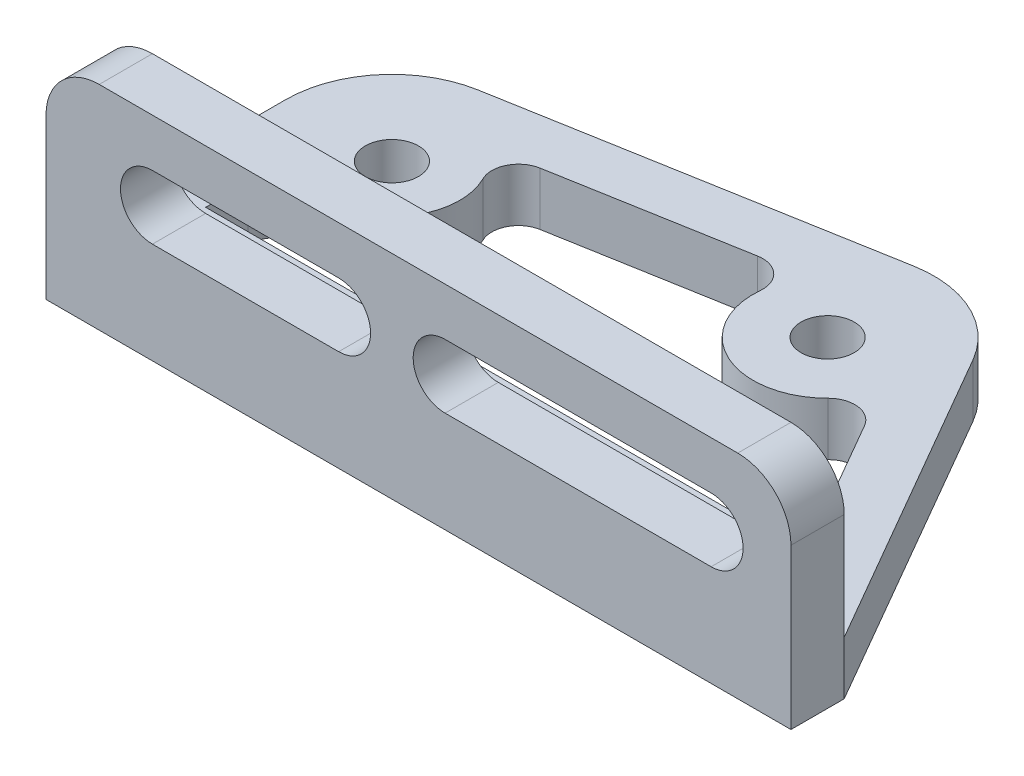
ISO-10303-21;
HEADER;
FILE_DESCRIPTION(('STEP AP214'),'2;1');
FILE_NAME('part.step','',(''),(''),'','','');
FILE_SCHEMA(('AUTOMOTIVE_DESIGN { 1 0 10303 214 1 1 1 1 }'));
ENDSEC;
DATA;
#1=APPLICATION_CONTEXT('core data for automotive mechanical design processes');
#2=APPLICATION_PROTOCOL_DEFINITION('international standard','automotive_design',2000,#1);
#3=PRODUCT_CONTEXT('',#1,'mechanical');
#4=PRODUCT('Part','Part','',(#3));
#5=PRODUCT_RELATED_PRODUCT_CATEGORY('part','',(#4));
#6=PRODUCT_DEFINITION_FORMATION('','',#4);
#7=PRODUCT_DEFINITION_CONTEXT('part definition',#1,'design');
#8=PRODUCT_DEFINITION('design','',#6,#7);
#9=PRODUCT_DEFINITION_SHAPE('','',#8);
#10=(LENGTH_UNIT() NAMED_UNIT(*) SI_UNIT(.MILLI.,.METRE.));
#11=(NAMED_UNIT(*) PLANE_ANGLE_UNIT() SI_UNIT($,.RADIAN.));
#12=(NAMED_UNIT(*) SI_UNIT($,.STERADIAN.) SOLID_ANGLE_UNIT());
#13=UNCERTAINTY_MEASURE_WITH_UNIT(LENGTH_MEASURE(1.E-05),#10,'distance_accuracy_value','');
#14=(GEOMETRIC_REPRESENTATION_CONTEXT(3) GLOBAL_UNCERTAINTY_ASSIGNED_CONTEXT((#13)) GLOBAL_UNIT_ASSIGNED_CONTEXT((#10,
#11,#12)) REPRESENTATION_CONTEXT('',''));
#15=CARTESIAN_POINT('',(0.,0.,0.));
#16=DIRECTION('',(0.,0.,1.));
#17=DIRECTION('',(1.,0.,0.));
#18=AXIS2_PLACEMENT_3D('',#15,#16,#17);
#19=CARTESIAN_POINT('',(20.,10.,-35.));
#20=DIRECTION('',(0.,-1.,0.));
#21=DIRECTION('',(0.,0.,-1.));
#22=AXIS2_PLACEMENT_3D('',#19,#20,#21);
#23=PLANE('',#22);
#24=DIRECTION('',(1.,0.,0.));
#25=VECTOR('',#24,1.);
#26=CARTESIAN_POINT('',(140.,10.,0.));
#27=LINE('',#26,#25);
#28=CARTESIAN_POINT('',(0.,10.,0.));
#29=VERTEX_POINT('',#28);
#30=CARTESIAN_POINT('',(140.,10.,0.));
#31=VERTEX_POINT('',#30);
#32=EDGE_CURVE('E385',#29,#31,#27,.T.);
#33=ORIENTED_EDGE('',*,*,#32,.T.);
#34=DIRECTION('',(-0.500000000000004,0.,-0.866025403784436));
#35=VECTOR('',#34,1.);
#36=CARTESIAN_POINT('',(106.932561687035,10.,-57.2744832342041));
#37=LINE('',#36,#35);
#38=CARTESIAN_POINT('',(106.932561687035,10.,-57.2744832342041));
#39=VERTEX_POINT('',#38);
#40=EDGE_CURVE('E388',#31,#39,#37,.T.);
#41=ORIENTED_EDGE('',*,*,#40,.T.);
#42=CARTESIAN_POINT('',(89.6120536113465,10.,-47.274483234204));
#43=DIRECTION('',(0.,1.,0.));
#44=DIRECTION('',(0.,0.,-1.));
#45=AXIS2_PLACEMENT_3D('',#42,#43,#44);
#46=CIRCLE('',#45,20.);
#47=CARTESIAN_POINT('',(86.139090058008,10.,-66.9706382944482));
#48=VERTEX_POINT('',#47);
#49=EDGE_CURVE('E391',#39,#48,#46,.T.);
#50=ORIENTED_EDGE('',*,*,#49,.T.);
#51=DIRECTION('',(-0.984807753012209,0.,0.173648177666924));
#52=VECTOR('',#51,1.);
#53=CARTESIAN_POINT('',(16.5270364466615,10.,-54.6961550602442));
#54=LINE('',#53,#52);
#55=CARTESIAN_POINT('',(16.5270364466615,10.,-54.6961550602442));
#56=VERTEX_POINT('',#55);
#57=EDGE_CURVE('E393',#48,#56,#54,.T.);
#58=ORIENTED_EDGE('',*,*,#57,.T.);
#59=CARTESIAN_POINT('',(20.,10.,-35.));
#60=DIRECTION('',(0.,1.,0.));
#61=DIRECTION('',(0.,0.,-1.));
#62=AXIS2_PLACEMENT_3D('',#59,#60,#61);
#63=CIRCLE('',#62,20.);
#64=CARTESIAN_POINT('',(0.,10.,-35.));
#65=VERTEX_POINT('',#64);
#66=EDGE_CURVE('E395',#56,#65,#63,.T.);
#67=ORIENTED_EDGE('',*,*,#66,.T.);
#68=DIRECTION('',(0.,0.,1.));
#69=VECTOR('',#68,1.);
#70=CARTESIAN_POINT('',(0.,10.,0.));
#71=LINE('',#70,#69);
#72=EDGE_CURVE('E397',#65,#29,#71,.T.);
#73=ORIENTED_EDGE('',*,*,#72,.T.);
#74=EDGE_LOOP('',(#33,#41,#50,#58,#67,#73));
#75=FACE_BOUND('',#74,.T.);
#76=DIRECTION('',(-0.5,0.,-0.866025403784439));
#77=VECTOR('',#76,1.);
#78=CARTESIAN_POINT('',(107.44176757749,10.,-36.3925127604223));
#79=LINE('',#78,#77);
#80=CARTESIAN_POINT('',(122.679491924311,10.,-10.));
#81=VERTEX_POINT('',#80);
#82=CARTESIAN_POINT('',(107.44176757749,10.,-36.3925127604223));
#83=VERTEX_POINT('',#82);
#84=EDGE_CURVE('E312',#81,#83,#79,.T.);
#85=ORIENTED_EDGE('',*,*,#84,.F.);
#86=DIRECTION('',(1.,0.,0.));
#87=VECTOR('',#86,1.);
#88=CARTESIAN_POINT('',(122.679491924311,10.,-10.));
#89=LINE('',#88,#87);
#90=CARTESIAN_POINT('',(10.,10.,-10.));
#91=VERTEX_POINT('',#90);
#92=EDGE_CURVE('E332',#91,#81,#89,.T.);
#93=ORIENTED_EDGE('',*,*,#92,.F.);
#94=DIRECTION('',(0.,0.,1.));
#95=VECTOR('',#94,1.);
#96=CARTESIAN_POINT('',(10.,10.,-10.));
#97=LINE('',#96,#95);
#98=CARTESIAN_POINT('',(10.,10.,-17.9621628546094));
#99=VERTEX_POINT('',#98);
#100=EDGE_CURVE('E329',#99,#91,#97,.T.);
#101=ORIENTED_EDGE('',*,*,#100,.F.);
#102=CARTESIAN_POINT('',(15.,10.,-17.9621628546094));
#103=DIRECTION('',(0.,1.,0.));
#104=DIRECTION('',(0.,0.,1.));
#105=AXIS2_PLACEMENT_3D('',#102,#103,#104);
#106=CIRCLE('',#105,5.);
#107=CARTESIAN_POINT('',(16.4079471740627,10.,-22.7598377868082));
#108=VERTEX_POINT('',#107);
#109=EDGE_CURVE('E327',#108,#99,#106,.T.);
#110=ORIENTED_EDGE('',*,*,#109,.F.);
#111=CARTESIAN_POINT('',(20.,10.,-35.));
#112=DIRECTION('',(0.,-1.,0.));
#113=DIRECTION('',(0.,0.,1.));
#114=AXIS2_PLACEMENT_3D('',#111,#112,#113);
#115=CIRCLE('',#114,12.756348008328);
#116=CARTESIAN_POINT('',(31.4304532183711,10.,-40.6629633348807));
#117=VERTEX_POINT('',#116);
#118=EDGE_CURVE('E325',#117,#108,#115,.T.);
#119=ORIENTED_EDGE('',*,*,#118,.F.);
#120=CARTESIAN_POINT('',(35.9107532270055,10.,-42.882628136744));
#121=DIRECTION('',(0.,1.,0.));
#122=DIRECTION('',(0.,0.,-1.));
#123=AXIS2_PLACEMENT_3D('',#120,#121,#122);
#124=CIRCLE('',#123,5.);
#125=CARTESIAN_POINT('',(35.0425123386709,10.,-47.806666901805));
#126=VERTEX_POINT('',#125);
#127=EDGE_CURVE('E323',#126,#117,#124,.T.);
#128=ORIENTED_EDGE('',*,*,#127,.F.);
#129=DIRECTION('',(-0.984807753012209,0.,0.173648177666923));
#130=VECTOR('',#129,1.);
#131=CARTESIAN_POINT('',(35.0425123386709,10.,-47.806666901805));
#132=LINE('',#131,#130);
#133=CARTESIAN_POINT('',(69.8152613780289,10.,-53.9380407508479));
#134=VERTEX_POINT('',#133);
#135=EDGE_CURVE('E321',#134,#126,#132,.T.);
#136=ORIENTED_EDGE('',*,*,#135,.F.);
#137=CARTESIAN_POINT('',(70.6835022663635,10.,-49.0140019857869));
#138=DIRECTION('',(0.,1.,0.));
#139=DIRECTION('',(0.,0.,1.));
#140=AXIS2_PLACEMENT_3D('',#137,#138,#139);
#141=CIRCLE('',#140,5.);
#142=CARTESIAN_POINT('',(75.6625214099861,10.,-48.5564341029115));
#143=VERTEX_POINT('',#142);
#144=EDGE_CURVE('E319',#143,#134,#141,.T.);
#145=ORIENTED_EDGE('',*,*,#144,.F.);
#146=CARTESIAN_POINT('',(89.6120536113465,10.,-47.274483234204));
#147=DIRECTION('',(0.,-1.,0.));
#148=DIRECTION('',(0.,0.,1.));
#149=AXIS2_PLACEMENT_3D('',#146,#147,#148);
#150=CIRCLE('',#149,14.0083134840197);
#151=CARTESIAN_POINT('',(99.5606714106291,10.,-37.4125437418747));
#152=VERTEX_POINT('',#151);
#153=EDGE_CURVE('E317',#152,#143,#150,.T.);
#154=ORIENTED_EDGE('',*,*,#153,.F.);
#155=CARTESIAN_POINT('',(103.111640558568,10.,-33.8925127604223));
#156=DIRECTION('',(0.,1.,0.));
#157=DIRECTION('',(0.,0.,-1.));
#158=AXIS2_PLACEMENT_3D('',#155,#156,#157);
#159=CIRCLE('',#158,5.);
#160=EDGE_CURVE('E314',#83,#152,#159,.T.);
#161=ORIENTED_EDGE('',*,*,#160,.F.);
#162=EDGE_LOOP('',(#85,#93,#101,#110,#119,#128,#136,#145,#154,#161));
#163=FACE_BOUND('',#162,.T.);
#164=CARTESIAN_POINT('',(20.,10.,-35.));
#165=DIRECTION('',(0.,1.,0.));
#166=DIRECTION('',(0.,0.,1.));
#167=AXIS2_PLACEMENT_3D('',#164,#165,#166);
#168=CIRCLE('',#167,5.);
#169=CARTESIAN_POINT('',(20.,10.,-30.));
#170=VERTEX_POINT('',#169);
#171=EDGE_CURVE('E306',#170,#170,#168,.T.);
#172=ORIENTED_EDGE('',*,*,#171,.F.);
#173=EDGE_LOOP('',(#172));
#174=FACE_BOUND('',#173,.T.);
#175=CARTESIAN_POINT('',(89.6120536113465,10.,-47.274483234204));
#176=DIRECTION('',(0.,1.,0.));
#177=DIRECTION('',(0.,0.,1.));
#178=AXIS2_PLACEMENT_3D('',#175,#176,#177);
#179=CIRCLE('',#178,5.00000000000001);
#180=CARTESIAN_POINT('',(89.6120536113465,10.,-42.274483234204));
#181=VERTEX_POINT('',#180);
#182=EDGE_CURVE('E300',#181,#181,#179,.T.);
#183=ORIENTED_EDGE('',*,*,#182,.F.);
#184=EDGE_LOOP('',(#183));
#185=FACE_BOUND('',#184,.T.);
#186=ADVANCED_FACE('F35',(#75,#163,#174,#185),#23,.F.);
#187=CARTESIAN_POINT('',(20.,0.,-35.));
#188=DIRECTION('',(0.,-1.,0.));
#189=DIRECTION('',(0.,0.,-1.));
#190=AXIS2_PLACEMENT_3D('',#187,#188,#189);
#191=PLANE('',#190);
#192=CARTESIAN_POINT('',(20.,0.,-35.));
#193=DIRECTION('',(0.,1.,0.));
#194=DIRECTION('',(0.,0.,1.));
#195=AXIS2_PLACEMENT_3D('',#192,#193,#194);
#196=CIRCLE('',#195,5.);
#197=CARTESIAN_POINT('',(20.,0.,-30.));
#198=VERTEX_POINT('',#197);
#199=EDGE_CURVE('E303',#198,#198,#196,.T.);
#200=ORIENTED_EDGE('',*,*,#199,.T.);
#201=EDGE_LOOP('',(#200));
#202=FACE_BOUND('',#201,.T.);
#203=DIRECTION('',(-0.500000000000004,0.,-0.866025403784436));
#204=VECTOR('',#203,1.);
#205=CARTESIAN_POINT('',(106.932561687035,0.,-57.2744832342041));
#206=LINE('',#205,#204);
#207=CARTESIAN_POINT('',(140.,0.,0.));
#208=VERTEX_POINT('',#207);
#209=CARTESIAN_POINT('',(106.932561687035,0.,-57.2744832342041));
#210=VERTEX_POINT('',#209);
#211=EDGE_CURVE('E384',#208,#210,#206,.T.);
#212=ORIENTED_EDGE('',*,*,#211,.F.);
#213=DIRECTION('',(0.,0.,-1.));
#214=VECTOR('',#213,1.);
#215=CARTESIAN_POINT('',(140.,0.,0.));
#216=LINE('',#215,#214);
#217=CARTESIAN_POINT('',(140.,0.,10.));
#218=VERTEX_POINT('',#217);
#219=EDGE_CURVE('E288',#218,#208,#216,.T.);
#220=ORIENTED_EDGE('',*,*,#219,.F.);
#221=DIRECTION('',(1.,0.,0.));
#222=VECTOR('',#221,1.);
#223=CARTESIAN_POINT('',(0.,0.,10.));
#224=LINE('',#223,#222);
#225=CARTESIAN_POINT('',(0.,0.,10.));
#226=VERTEX_POINT('',#225);
#227=EDGE_CURVE('E285',#226,#218,#224,.T.);
#228=ORIENTED_EDGE('',*,*,#227,.F.);
#229=DIRECTION('',(0.,0.,1.));
#230=VECTOR('',#229,1.);
#231=CARTESIAN_POINT('',(0.,0.,0.));
#232=LINE('',#231,#230);
#233=CARTESIAN_POINT('',(0.,0.,-35.));
#234=VERTEX_POINT('',#233);
#235=EDGE_CURVE('E389',#234,#226,#232,.T.);
#236=ORIENTED_EDGE('',*,*,#235,.F.);
#237=CARTESIAN_POINT('',(20.,0.,-35.));
#238=DIRECTION('',(0.,1.,0.));
#239=DIRECTION('',(0.,0.,-1.));
#240=AXIS2_PLACEMENT_3D('',#237,#238,#239);
#241=CIRCLE('',#240,20.);
#242=CARTESIAN_POINT('',(16.5270364466615,0.,-54.6961550602442));
#243=VERTEX_POINT('',#242);
#244=EDGE_CURVE('E406',#243,#234,#241,.T.);
#245=ORIENTED_EDGE('',*,*,#244,.F.);
#246=DIRECTION('',(-0.984807753012209,0.,0.173648177666924));
#247=VECTOR('',#246,1.);
#248=CARTESIAN_POINT('',(16.5270364466615,0.,-54.6961550602442));
#249=LINE('',#248,#247);
#250=CARTESIAN_POINT('',(86.139090058008,0.,-66.9706382944482));
#251=VERTEX_POINT('',#250);
#252=EDGE_CURVE('E404',#251,#243,#249,.T.);
#253=ORIENTED_EDGE('',*,*,#252,.F.);
#254=CARTESIAN_POINT('',(89.6120536113465,0.,-47.274483234204));
#255=DIRECTION('',(0.,1.,0.));
#256=DIRECTION('',(0.,0.,-1.));
#257=AXIS2_PLACEMENT_3D('',#254,#255,#256);
#258=CIRCLE('',#257,20.);
#259=EDGE_CURVE('E402',#210,#251,#258,.T.);
#260=ORIENTED_EDGE('',*,*,#259,.F.);
#261=EDGE_LOOP('',(#212,#220,#228,#236,#245,#253,#260));
#262=FACE_BOUND('',#261,.T.);
#263=DIRECTION('',(1.,0.,0.));
#264=VECTOR('',#263,1.);
#265=CARTESIAN_POINT('',(122.679491924311,0.,-10.));
#266=LINE('',#265,#264);
#267=CARTESIAN_POINT('',(10.,0.,-10.));
#268=VERTEX_POINT('',#267);
#269=CARTESIAN_POINT('',(122.679491924311,0.,-10.));
#270=VERTEX_POINT('',#269);
#271=EDGE_CURVE('E315',#268,#270,#266,.T.);
#272=ORIENTED_EDGE('',*,*,#271,.T.);
#273=DIRECTION('',(-0.5,0.,-0.866025403784439));
#274=VECTOR('',#273,1.);
#275=CARTESIAN_POINT('',(107.44176757749,0.,-36.3925127604223));
#276=LINE('',#275,#274);
#277=CARTESIAN_POINT('',(107.44176757749,0.,-36.3925127604223));
#278=VERTEX_POINT('',#277);
#279=EDGE_CURVE('E309',#270,#278,#276,.T.);
#280=ORIENTED_EDGE('',*,*,#279,.T.);
#281=CARTESIAN_POINT('',(103.111640558568,0.,-33.8925127604223));
#282=DIRECTION('',(0.,1.,0.));
#283=DIRECTION('',(0.,0.,-1.));
#284=AXIS2_PLACEMENT_3D('',#281,#282,#283);
#285=CIRCLE('',#284,5.);
#286=CARTESIAN_POINT('',(99.5606714106291,0.,-37.4125437418747));
#287=VERTEX_POINT('',#286);
#288=EDGE_CURVE('E337',#278,#287,#285,.T.);
#289=ORIENTED_EDGE('',*,*,#288,.T.);
#290=CARTESIAN_POINT('',(89.6120536113465,0.,-47.274483234204));
#291=DIRECTION('',(0.,-1.,0.));
#292=DIRECTION('',(0.,0.,1.));
#293=AXIS2_PLACEMENT_3D('',#290,#291,#292);
#294=CIRCLE('',#293,14.0083134840197);
#295=CARTESIAN_POINT('',(75.6625214099861,0.,-48.5564341029115));
#296=VERTEX_POINT('',#295);
#297=EDGE_CURVE('E340',#287,#296,#294,.T.);
#298=ORIENTED_EDGE('',*,*,#297,.T.);
#299=CARTESIAN_POINT('',(70.6835022663635,0.,-49.0140019857869));
#300=DIRECTION('',(0.,1.,0.));
#301=DIRECTION('',(0.,0.,1.));
#302=AXIS2_PLACEMENT_3D('',#299,#300,#301);
#303=CIRCLE('',#302,5.);
#304=CARTESIAN_POINT('',(69.8152613780289,0.,-53.9380407508479));
#305=VERTEX_POINT('',#304);
#306=EDGE_CURVE('E343',#296,#305,#303,.T.);
#307=ORIENTED_EDGE('',*,*,#306,.T.);
#308=DIRECTION('',(-0.984807753012209,0.,0.173648177666923));
#309=VECTOR('',#308,1.);
#310=CARTESIAN_POINT('',(35.0425123386709,0.,-47.806666901805));
#311=LINE('',#310,#309);
#312=CARTESIAN_POINT('',(35.0425123386709,0.,-47.806666901805));
#313=VERTEX_POINT('',#312);
#314=EDGE_CURVE('E346',#305,#313,#311,.T.);
#315=ORIENTED_EDGE('',*,*,#314,.T.);
#316=CARTESIAN_POINT('',(35.9107532270055,0.,-42.882628136744));
#317=DIRECTION('',(0.,1.,0.));
#318=DIRECTION('',(0.,0.,-1.));
#319=AXIS2_PLACEMENT_3D('',#316,#317,#318);
#320=CIRCLE('',#319,5.);
#321=CARTESIAN_POINT('',(31.4304532183711,0.,-40.6629633348807));
#322=VERTEX_POINT('',#321);
#323=EDGE_CURVE('E349',#313,#322,#320,.T.);
#324=ORIENTED_EDGE('',*,*,#323,.T.);
#325=CARTESIAN_POINT('',(20.,0.,-35.));
#326=DIRECTION('',(0.,-1.,0.));
#327=DIRECTION('',(0.,0.,1.));
#328=AXIS2_PLACEMENT_3D('',#325,#326,#327);
#329=CIRCLE('',#328,12.756348008328);
#330=CARTESIAN_POINT('',(16.4079471740627,0.,-22.7598377868082));
#331=VERTEX_POINT('',#330);
#332=EDGE_CURVE('E352',#322,#331,#329,.T.);
#333=ORIENTED_EDGE('',*,*,#332,.T.);
#334=CARTESIAN_POINT('',(15.,0.,-17.9621628546094));
#335=DIRECTION('',(0.,1.,0.));
#336=DIRECTION('',(0.,0.,1.));
#337=AXIS2_PLACEMENT_3D('',#334,#335,#336);
#338=CIRCLE('',#337,5.);
#339=CARTESIAN_POINT('',(10.,0.,-17.9621628546094));
#340=VERTEX_POINT('',#339);
#341=EDGE_CURVE('E355',#331,#340,#338,.T.);
#342=ORIENTED_EDGE('',*,*,#341,.T.);
#343=DIRECTION('',(0.,0.,1.));
#344=VECTOR('',#343,1.);
#345=CARTESIAN_POINT('',(10.,0.,-10.));
#346=LINE('',#345,#344);
#347=EDGE_CURVE('E358',#340,#268,#346,.T.);
#348=ORIENTED_EDGE('',*,*,#347,.T.);
#349=EDGE_LOOP('',(#272,#280,#289,#298,#307,#315,#324,#333,#342,#348));
#350=FACE_BOUND('',#349,.T.);
#351=CARTESIAN_POINT('',(89.6120536113465,0.,-47.274483234204));
#352=DIRECTION('',(0.,1.,0.));
#353=DIRECTION('',(0.,0.,1.));
#354=AXIS2_PLACEMENT_3D('',#351,#352,#353);
#355=CIRCLE('',#354,5.00000000000001);
#356=CARTESIAN_POINT('',(89.6120536113465,0.,-42.274483234204));
#357=VERTEX_POINT('',#356);
#358=EDGE_CURVE('E294',#357,#357,#355,.T.);
#359=ORIENTED_EDGE('',*,*,#358,.T.);
#360=EDGE_LOOP('',(#359));
#361=FACE_BOUND('',#360,.T.);
#362=ADVANCED_FACE('F483',(#202,#262,#350,#361),#191,.T.);
#363=CARTESIAN_POINT('',(106.932561687035,10.,-57.2744832342041));
#364=DIRECTION('',(-0.866025403784436,0.,0.500000000000004));
#365=DIRECTION('',(0.500000000000004,0.,0.866025403784436));
#366=AXIS2_PLACEMENT_3D('',#363,#364,#365);
#367=PLANE('',#366);
#368=ORIENTED_EDGE('',*,*,#211,.T.);
#369=DIRECTION('',(0.,-1.,0.));
#370=VECTOR('',#369,1.);
#371=CARTESIAN_POINT('',(106.932561687035,10.,-57.2744832342041));
#372=LINE('',#371,#370);
#373=EDGE_CURVE('E417',#39,#210,#372,.T.);
#374=ORIENTED_EDGE('',*,*,#373,.F.);
#375=ORIENTED_EDGE('',*,*,#40,.F.);
#376=DIRECTION('',(0.,-1.,0.));
#377=VECTOR('',#376,1.);
#378=CARTESIAN_POINT('',(140.,10.,0.));
#379=LINE('',#378,#377);
#380=EDGE_CURVE('E420',#31,#208,#379,.T.);
#381=ORIENTED_EDGE('',*,*,#380,.T.);
#382=EDGE_LOOP('',(#368,#374,#375,#381));
#383=FACE_BOUND('',#382,.T.);
#384=ADVANCED_FACE('F466',(#383),#367,.F.);
#385=CARTESIAN_POINT('',(89.6120536113465,10.,-47.274483234204));
#386=DIRECTION('',(0.,-1.,0.));
#387=DIRECTION('',(0.,0.,-1.));
#388=AXIS2_PLACEMENT_3D('',#385,#386,#387);
#389=CYLINDRICAL_SURFACE('',#388,20.);
#390=ORIENTED_EDGE('',*,*,#259,.T.);
#391=DIRECTION('',(0.,-1.,0.));
#392=VECTOR('',#391,1.);
#393=CARTESIAN_POINT('',(86.139090058008,10.,-66.9706382944482));
#394=LINE('',#393,#392);
#395=EDGE_CURVE('E414',#48,#251,#394,.T.);
#396=ORIENTED_EDGE('',*,*,#395,.F.);
#397=ORIENTED_EDGE('',*,*,#49,.F.);
#398=ORIENTED_EDGE('',*,*,#373,.T.);
#399=EDGE_LOOP('',(#390,#396,#397,#398));
#400=FACE_BOUND('',#399,.T.);
#401=ADVANCED_FACE('F503',(#400),#389,.T.);
#402=CARTESIAN_POINT('',(16.5270364466615,10.,-54.6961550602442));
#403=DIRECTION('',(0.173648177666924,0.,0.984807753012209));
#404=DIRECTION('',(0.984807753012209,0.,-0.173648177666924));
#405=AXIS2_PLACEMENT_3D('',#402,#403,#404);
#406=PLANE('',#405);
#407=ORIENTED_EDGE('',*,*,#252,.T.);
#408=DIRECTION('',(0.,-1.,0.));
#409=VECTOR('',#408,1.);
#410=CARTESIAN_POINT('',(16.5270364466615,10.,-54.6961550602442));
#411=LINE('',#410,#409);
#412=EDGE_CURVE('E411',#56,#243,#411,.T.);
#413=ORIENTED_EDGE('',*,*,#412,.F.);
#414=ORIENTED_EDGE('',*,*,#57,.F.);
#415=ORIENTED_EDGE('',*,*,#395,.T.);
#416=EDGE_LOOP('',(#407,#413,#414,#415));
#417=FACE_BOUND('',#416,.T.);
#418=ADVANCED_FACE('F499',(#417),#406,.F.);
#419=CARTESIAN_POINT('',(20.,10.,-35.));
#420=DIRECTION('',(0.,-1.,0.));
#421=DIRECTION('',(0.,0.,-1.));
#422=AXIS2_PLACEMENT_3D('',#419,#420,#421);
#423=CYLINDRICAL_SURFACE('',#422,20.);
#424=ORIENTED_EDGE('',*,*,#244,.T.);
#425=DIRECTION('',(0.,-1.,0.));
#426=VECTOR('',#425,1.);
#427=CARTESIAN_POINT('',(0.,10.,-35.));
#428=LINE('',#427,#426);
#429=EDGE_CURVE('E400',#65,#234,#428,.T.);
#430=ORIENTED_EDGE('',*,*,#429,.F.);
#431=ORIENTED_EDGE('',*,*,#66,.F.);
#432=ORIENTED_EDGE('',*,*,#412,.T.);
#433=EDGE_LOOP('',(#424,#430,#431,#432));
#434=FACE_BOUND('',#433,.T.);
#435=ADVANCED_FACE('F496',(#434),#423,.T.);
#436=CARTESIAN_POINT('',(0.,10.,0.));
#437=DIRECTION('',(1.,0.,0.));
#438=DIRECTION('',(0.,0.,-1.));
#439=AXIS2_PLACEMENT_3D('',#436,#437,#438);
#440=PLANE('',#439);
#441=DIRECTION('',(0.,1.,0.));
#442=VECTOR('',#441,1.);
#443=CARTESIAN_POINT('',(0.,0.,10.));
#444=LINE('',#443,#442);
#445=CARTESIAN_POINT('',(0.,30.,10.));
#446=VERTEX_POINT('',#445);
#447=EDGE_CURVE('E290',#226,#446,#444,.T.);
#448=ORIENTED_EDGE('',*,*,#447,.T.);
#449=DIRECTION('',(0.,0.,1.));
#450=VECTOR('',#449,1.);
#451=CARTESIAN_POINT('',(0.,30.,0.));
#452=LINE('',#451,#450);
#453=CARTESIAN_POINT('',(0.,30.,0.));
#454=VERTEX_POINT('',#453);
#455=EDGE_CURVE('E11',#446,#454,#452,.F.);
#456=ORIENTED_EDGE('',*,*,#455,.T.);
#457=DIRECTION('',(0.,1.,0.));
#458=VECTOR('',#457,1.);
#459=CARTESIAN_POINT('',(0.,0.,0.));
#460=LINE('',#459,#458);
#461=EDGE_CURVE('E291',#29,#454,#460,.T.);
#462=ORIENTED_EDGE('',*,*,#461,.F.);
#463=ORIENTED_EDGE('',*,*,#72,.F.);
#464=ORIENTED_EDGE('',*,*,#429,.T.);
#465=ORIENTED_EDGE('',*,*,#235,.T.);
#466=EDGE_LOOP('',(#448,#456,#462,#463,#464,#465));
#467=FACE_BOUND('',#466,.T.);
#468=ADVANCED_FACE('F475',(#467),#440,.F.);
#469=CARTESIAN_POINT('',(107.44176757749,10.,-36.3925127604223));
#470=DIRECTION('',(-0.866025403784439,0.,0.5));
#471=DIRECTION('',(0.5,0.,0.866025403784439));
#472=AXIS2_PLACEMENT_3D('',#469,#470,#471);
#473=PLANE('',#472);
#474=ORIENTED_EDGE('',*,*,#279,.F.);
#475=DIRECTION('',(0.,-1.,0.));
#476=VECTOR('',#475,1.);
#477=CARTESIAN_POINT('',(122.679491924311,10.,-10.));
#478=LINE('',#477,#476);
#479=EDGE_CURVE('E334',#81,#270,#478,.T.);
#480=ORIENTED_EDGE('',*,*,#479,.F.);
#481=ORIENTED_EDGE('',*,*,#84,.T.);
#482=DIRECTION('',(0.,-1.,0.));
#483=VECTOR('',#482,1.);
#484=CARTESIAN_POINT('',(107.44176757749,10.,-36.3925127604223));
#485=LINE('',#484,#483);
#486=EDGE_CURVE('E381',#83,#278,#485,.T.);
#487=ORIENTED_EDGE('',*,*,#486,.T.);
#488=EDGE_LOOP('',(#474,#480,#481,#487));
#489=FACE_BOUND('',#488,.T.);
#490=ADVANCED_FACE('F491',(#489),#473,.T.);
#491=CARTESIAN_POINT('',(103.111640558568,10.,-33.8925127604223));
#492=DIRECTION('',(0.,-1.,0.));
#493=DIRECTION('',(0.,0.,-1.));
#494=AXIS2_PLACEMENT_3D('',#491,#492,#493);
#495=CYLINDRICAL_SURFACE('',#494,5.);
#496=ORIENTED_EDGE('',*,*,#288,.F.);
#497=ORIENTED_EDGE('',*,*,#486,.F.);
#498=ORIENTED_EDGE('',*,*,#160,.T.);
#499=DIRECTION('',(0.,-1.,0.));
#500=VECTOR('',#499,1.);
#501=CARTESIAN_POINT('',(99.5606714106291,10.,-37.4125437418747));
#502=LINE('',#501,#500);
#503=EDGE_CURVE('E379',#152,#287,#502,.T.);
#504=ORIENTED_EDGE('',*,*,#503,.T.);
#505=EDGE_LOOP('',(#496,#497,#498,#504));
#506=FACE_BOUND('',#505,.T.);
#507=ADVANCED_FACE('F538',(#506),#495,.F.);
#508=CARTESIAN_POINT('',(89.6120536113465,10.,-47.274483234204));
#509=DIRECTION('',(0.,-1.,0.));
#510=DIRECTION('',(0.,0.,-1.));
#511=AXIS2_PLACEMENT_3D('',#508,#509,#510);
#512=CYLINDRICAL_SURFACE('',#511,14.0083134840197);
#513=ORIENTED_EDGE('',*,*,#297,.F.);
#514=ORIENTED_EDGE('',*,*,#503,.F.);
#515=ORIENTED_EDGE('',*,*,#153,.T.);
#516=DIRECTION('',(0.,-1.,0.));
#517=VECTOR('',#516,1.);
#518=CARTESIAN_POINT('',(75.6625214099861,10.,-48.5564341029115));
#519=LINE('',#518,#517);
#520=EDGE_CURVE('E377',#143,#296,#519,.T.);
#521=ORIENTED_EDGE('',*,*,#520,.T.);
#522=EDGE_LOOP('',(#513,#514,#515,#521));
#523=FACE_BOUND('',#522,.T.);
#524=ADVANCED_FACE('F545',(#523),#512,.T.);
#525=CARTESIAN_POINT('',(70.6835022663635,10.,-49.0140019857869));
#526=DIRECTION('',(0.,-1.,0.));
#527=DIRECTION('',(0.,0.,-1.));
#528=AXIS2_PLACEMENT_3D('',#525,#526,#527);
#529=CYLINDRICAL_SURFACE('',#528,5.);
#530=ORIENTED_EDGE('',*,*,#306,.F.);
#531=ORIENTED_EDGE('',*,*,#520,.F.);
#532=ORIENTED_EDGE('',*,*,#144,.T.);
#533=DIRECTION('',(0.,-1.,0.));
#534=VECTOR('',#533,1.);
#535=CARTESIAN_POINT('',(69.8152613780289,10.,-53.9380407508479));
#536=LINE('',#535,#534);
#537=EDGE_CURVE('E375',#134,#305,#536,.T.);
#538=ORIENTED_EDGE('',*,*,#537,.T.);
#539=EDGE_LOOP('',(#530,#531,#532,#538));
#540=FACE_BOUND('',#539,.T.);
#541=ADVANCED_FACE('F552',(#540),#529,.F.);
#542=CARTESIAN_POINT('',(35.0425123386709,10.,-47.806666901805));
#543=DIRECTION('',(0.173648177666923,0.,0.984807753012209));
#544=DIRECTION('',(0.984807753012209,0.,-0.173648177666923));
#545=AXIS2_PLACEMENT_3D('',#542,#543,#544);
#546=PLANE('',#545);
#547=ORIENTED_EDGE('',*,*,#314,.F.);
#548=ORIENTED_EDGE('',*,*,#537,.F.);
#549=ORIENTED_EDGE('',*,*,#135,.T.);
#550=DIRECTION('',(0.,-1.,0.));
#551=VECTOR('',#550,1.);
#552=CARTESIAN_POINT('',(35.0425123386709,10.,-47.806666901805));
#553=LINE('',#552,#551);
#554=EDGE_CURVE('E373',#126,#313,#553,.T.);
#555=ORIENTED_EDGE('',*,*,#554,.T.);
#556=EDGE_LOOP('',(#547,#548,#549,#555));
#557=FACE_BOUND('',#556,.T.);
#558=ADVANCED_FACE('F560',(#557),#546,.T.);
#559=CARTESIAN_POINT('',(35.9107532270055,10.,-42.882628136744));
#560=DIRECTION('',(0.,-1.,0.));
#561=DIRECTION('',(0.,0.,-1.));
#562=AXIS2_PLACEMENT_3D('',#559,#560,#561);
#563=CYLINDRICAL_SURFACE('',#562,5.);
#564=ORIENTED_EDGE('',*,*,#323,.F.);
#565=ORIENTED_EDGE('',*,*,#554,.F.);
#566=ORIENTED_EDGE('',*,*,#127,.T.);
#567=DIRECTION('',(0.,-1.,0.));
#568=VECTOR('',#567,1.);
#569=CARTESIAN_POINT('',(31.4304532183711,10.,-40.6629633348807));
#570=LINE('',#569,#568);
#571=EDGE_CURVE('E371',#117,#322,#570,.T.);
#572=ORIENTED_EDGE('',*,*,#571,.T.);
#573=EDGE_LOOP('',(#564,#565,#566,#572));
#574=FACE_BOUND('',#573,.T.);
#575=ADVANCED_FACE('F568',(#574),#563,.F.);
#576=CARTESIAN_POINT('',(20.,10.,-35.));
#577=DIRECTION('',(0.,-1.,0.));
#578=DIRECTION('',(0.,0.,-1.));
#579=AXIS2_PLACEMENT_3D('',#576,#577,#578);
#580=CYLINDRICAL_SURFACE('',#579,12.756348008328);
#581=ORIENTED_EDGE('',*,*,#332,.F.);
#582=ORIENTED_EDGE('',*,*,#571,.F.);
#583=ORIENTED_EDGE('',*,*,#118,.T.);
#584=DIRECTION('',(0.,-1.,0.));
#585=VECTOR('',#584,1.);
#586=CARTESIAN_POINT('',(16.4079471740627,10.,-22.7598377868082));
#587=LINE('',#586,#585);
#588=EDGE_CURVE('E369',#108,#331,#587,.T.);
#589=ORIENTED_EDGE('',*,*,#588,.T.);
#590=EDGE_LOOP('',(#581,#582,#583,#589));
#591=FACE_BOUND('',#590,.T.);
#592=ADVANCED_FACE('F576',(#591),#580,.T.);
#593=CARTESIAN_POINT('',(15.,10.,-17.9621628546094));
#594=DIRECTION('',(0.,-1.,0.));
#595=DIRECTION('',(0.,0.,-1.));
#596=AXIS2_PLACEMENT_3D('',#593,#594,#595);
#597=CYLINDRICAL_SURFACE('',#596,5.);
#598=ORIENTED_EDGE('',*,*,#341,.F.);
#599=ORIENTED_EDGE('',*,*,#588,.F.);
#600=ORIENTED_EDGE('',*,*,#109,.T.);
#601=DIRECTION('',(0.,-1.,0.));
#602=VECTOR('',#601,1.);
#603=CARTESIAN_POINT('',(10.,10.,-17.9621628546094));
#604=LINE('',#603,#602);
#605=EDGE_CURVE('E367',#99,#340,#604,.T.);
#606=ORIENTED_EDGE('',*,*,#605,.T.);
#607=EDGE_LOOP('',(#598,#599,#600,#606));
#608=FACE_BOUND('',#607,.T.);
#609=ADVANCED_FACE('F584',(#608),#597,.F.);
#610=CARTESIAN_POINT('',(10.,10.,-10.));
#611=DIRECTION('',(1.,0.,0.));
#612=DIRECTION('',(0.,0.,-1.));
#613=AXIS2_PLACEMENT_3D('',#610,#611,#612);
#614=PLANE('',#613);
#615=ORIENTED_EDGE('',*,*,#347,.F.);
#616=ORIENTED_EDGE('',*,*,#605,.F.);
#617=ORIENTED_EDGE('',*,*,#100,.T.);
#618=DIRECTION('',(0.,-1.,0.));
#619=VECTOR('',#618,1.);
#620=CARTESIAN_POINT('',(10.,10.,-10.));
#621=LINE('',#620,#619);
#622=EDGE_CURVE('E365',#91,#268,#621,.T.);
#623=ORIENTED_EDGE('',*,*,#622,.T.);
#624=EDGE_LOOP('',(#615,#616,#617,#623));
#625=FACE_BOUND('',#624,.T.);
#626=ADVANCED_FACE('F592',(#625),#614,.T.);
#627=CARTESIAN_POINT('',(122.679491924311,10.,-10.));
#628=DIRECTION('',(0.,0.,-1.));
#629=DIRECTION('',(-1.,0.,0.));
#630=AXIS2_PLACEMENT_3D('',#627,#628,#629);
#631=PLANE('',#630);
#632=ORIENTED_EDGE('',*,*,#271,.F.);
#633=ORIENTED_EDGE('',*,*,#622,.F.);
#634=ORIENTED_EDGE('',*,*,#92,.T.);
#635=ORIENTED_EDGE('',*,*,#479,.T.);
#636=EDGE_LOOP('',(#632,#633,#634,#635));
#637=FACE_BOUND('',#636,.T.);
#638=ADVANCED_FACE('F600',(#637),#631,.T.);
#639=CARTESIAN_POINT('',(20.,10.,-35.));
#640=DIRECTION('',(0.,-1.,0.));
#641=DIRECTION('',(0.,0.,-1.));
#642=AXIS2_PLACEMENT_3D('',#639,#640,#641);
#643=CYLINDRICAL_SURFACE('',#642,5.);
#644=ORIENTED_EDGE('',*,*,#171,.T.);
#645=EDGE_LOOP('',(#644));
#646=FACE_BOUND('',#645,.T.);
#647=ORIENTED_EDGE('',*,*,#199,.F.);
#648=EDGE_LOOP('',(#647));
#649=FACE_BOUND('',#648,.T.);
#650=ADVANCED_FACE('F608',(#646,#649),#643,.F.);
#651=CARTESIAN_POINT('',(89.6120536113465,10.,-47.274483234204));
#652=DIRECTION('',(0.,-1.,0.));
#653=DIRECTION('',(0.,0.,-1.));
#654=AXIS2_PLACEMENT_3D('',#651,#652,#653);
#655=CYLINDRICAL_SURFACE('',#654,5.00000000000001);
#656=ORIENTED_EDGE('',*,*,#182,.T.);
#657=EDGE_LOOP('',(#656));
#658=FACE_BOUND('',#657,.T.);
#659=ORIENTED_EDGE('',*,*,#358,.F.);
#660=EDGE_LOOP('',(#659));
#661=FACE_BOUND('',#660,.T.);
#662=ADVANCED_FACE('F616',(#658,#661),#655,.F.);
#663=CARTESIAN_POINT('',(0.,0.,0.));
#664=DIRECTION('',(0.,0.,-1.));
#665=DIRECTION('',(-1.,0.,0.));
#666=AXIS2_PLACEMENT_3D('',#663,#664,#665);
#667=PLANE('',#666);
#668=CARTESIAN_POINT('',(125.,25.,0.));
#669=DIRECTION('',(0.,0.,-1.));
#670=DIRECTION('',(-1.,0.,0.));
#671=AXIS2_PLACEMENT_3D('',#668,#669,#670);
#672=CIRCLE('',#671,6.);
#673=CARTESIAN_POINT('',(125.,31.,0.));
#674=VERTEX_POINT('',#673);
#675=CARTESIAN_POINT('',(125.,19.,0.));
#676=VERTEX_POINT('',#675);
#677=EDGE_CURVE('E245',#674,#676,#672,.T.);
#678=ORIENTED_EDGE('',*,*,#677,.F.);
#679=DIRECTION('',(1.,0.,0.));
#680=VECTOR('',#679,1.);
#681=CARTESIAN_POINT('',(125.,31.,0.));
#682=LINE('',#681,#680);
#683=CARTESIAN_POINT('',(75.,31.,0.));
#684=VERTEX_POINT('',#683);
#685=EDGE_CURVE('E250',#684,#674,#682,.T.);
#686=ORIENTED_EDGE('',*,*,#685,.F.);
#687=CARTESIAN_POINT('',(75.,25.,0.));
#688=DIRECTION('',(0.,0.,-1.));
#689=DIRECTION('',(-1.,0.,0.));
#690=AXIS2_PLACEMENT_3D('',#687,#688,#689);
#691=CIRCLE('',#690,6.);
#692=CARTESIAN_POINT('',(75.,19.,0.));
#693=VERTEX_POINT('',#692);
#694=EDGE_CURVE('E229',#693,#684,#691,.T.);
#695=ORIENTED_EDGE('',*,*,#694,.F.);
#696=DIRECTION('',(-1.,0.,0.));
#697=VECTOR('',#696,1.);
#698=CARTESIAN_POINT('',(125.,19.,0.));
#699=LINE('',#698,#697);
#700=EDGE_CURVE('E240',#676,#693,#699,.T.);
#701=ORIENTED_EDGE('',*,*,#700,.F.);
#702=EDGE_LOOP('',(#678,#686,#695,#701));
#703=FACE_BOUND('',#702,.T.);
#704=CARTESIAN_POINT('',(55.,25.,0.));
#705=DIRECTION('',(0.,0.,-1.));
#706=DIRECTION('',(-1.,0.,0.));
#707=AXIS2_PLACEMENT_3D('',#704,#705,#706);
#708=CIRCLE('',#707,6.);
#709=CARTESIAN_POINT('',(55.,31.,0.));
#710=VERTEX_POINT('',#709);
#711=CARTESIAN_POINT('',(55.,19.,0.));
#712=VERTEX_POINT('',#711);
#713=EDGE_CURVE('E260',#710,#712,#708,.T.);
#714=ORIENTED_EDGE('',*,*,#713,.F.);
#715=DIRECTION('',(1.,0.,0.));
#716=VECTOR('',#715,1.);
#717=CARTESIAN_POINT('',(55.,31.,0.));
#718=LINE('',#717,#716);
#719=CARTESIAN_POINT('',(20.,31.,0.));
#720=VERTEX_POINT('',#719);
#721=EDGE_CURVE('E268',#720,#710,#718,.T.);
#722=ORIENTED_EDGE('',*,*,#721,.F.);
#723=CARTESIAN_POINT('',(20.,25.,0.));
#724=DIRECTION('',(0.,0.,-1.));
#725=DIRECTION('',(-1.,0.,0.));
#726=AXIS2_PLACEMENT_3D('',#723,#724,#725);
#727=CIRCLE('',#726,6.);
#728=CARTESIAN_POINT('',(20.,19.,0.));
#729=VERTEX_POINT('',#728);
#730=EDGE_CURVE('E265',#729,#720,#727,.T.);
#731=ORIENTED_EDGE('',*,*,#730,.F.);
#732=DIRECTION('',(-1.,0.,0.));
#733=VECTOR('',#732,1.);
#734=CARTESIAN_POINT('',(55.,19.,0.));
#735=LINE('',#734,#733);
#736=EDGE_CURVE('E262',#712,#729,#735,.T.);
#737=ORIENTED_EDGE('',*,*,#736,.F.);
#738=EDGE_LOOP('',(#714,#722,#731,#737));
#739=FACE_BOUND('',#738,.T.);
#740=DIRECTION('',(-1.,0.,0.));
#741=VECTOR('',#740,1.);
#742=CARTESIAN_POINT('',(0.,40.,0.));
#743=LINE('',#742,#741);
#744=CARTESIAN_POINT('',(130.,40.,0.));
#745=VERTEX_POINT('',#744);
#746=CARTESIAN_POINT('',(10.,40.,0.));
#747=VERTEX_POINT('',#746);
#748=EDGE_CURVE('E282',#745,#747,#743,.T.);
#749=ORIENTED_EDGE('',*,*,#748,.F.);
#750=CARTESIAN_POINT('',(130.,30.,0.));
#751=DIRECTION('',(0.,0.,-1.));
#752=DIRECTION('',(-1.,0.,0.));
#753=AXIS2_PLACEMENT_3D('',#750,#751,#752);
#754=CIRCLE('',#753,10.);
#755=CARTESIAN_POINT('',(140.,30.,0.));
#756=VERTEX_POINT('',#755);
#757=EDGE_CURVE('E447',#745,#756,#754,.T.);
#758=ORIENTED_EDGE('',*,*,#757,.T.);
#759=DIRECTION('',(0.,1.,0.));
#760=VECTOR('',#759,1.);
#761=CARTESIAN_POINT('',(140.,0.,0.));
#762=LINE('',#761,#760);
#763=EDGE_CURVE('E295',#31,#756,#762,.T.);
#764=ORIENTED_EDGE('',*,*,#763,.F.);
#765=ORIENTED_EDGE('',*,*,#32,.F.);
#766=ORIENTED_EDGE('',*,*,#461,.T.);
#767=CARTESIAN_POINT('',(10.,30.,0.));
#768=DIRECTION('',(0.,0.,-1.));
#769=DIRECTION('',(-1.,0.,0.));
#770=AXIS2_PLACEMENT_3D('',#767,#768,#769);
#771=CIRCLE('',#770,10.);
#772=EDGE_CURVE('E445',#454,#747,#771,.T.);
#773=ORIENTED_EDGE('',*,*,#772,.T.);
#774=EDGE_LOOP('',(#749,#758,#764,#765,#766,#773));
#775=FACE_BOUND('',#774,.T.);
#776=ADVANCED_FACE('F247',(#703,#739,#775),#667,.T.);
#777=CARTESIAN_POINT('',(140.,0.,0.));
#778=DIRECTION('',(1.,0.,0.));
#779=DIRECTION('',(0.,0.,-1.));
#780=AXIS2_PLACEMENT_3D('',#777,#778,#779);
#781=PLANE('',#780);
#782=ORIENTED_EDGE('',*,*,#763,.T.);
#783=DIRECTION('',(0.,0.,-1.));
#784=VECTOR('',#783,1.);
#785=CARTESIAN_POINT('',(140.,30.,0.));
#786=LINE('',#785,#784);
#787=CARTESIAN_POINT('',(140.,30.,10.));
#788=VERTEX_POINT('',#787);
#789=EDGE_CURVE('E58',#756,#788,#786,.F.);
#790=ORIENTED_EDGE('',*,*,#789,.T.);
#791=DIRECTION('',(0.,1.,0.));
#792=VECTOR('',#791,1.);
#793=CARTESIAN_POINT('',(140.,0.,10.));
#794=LINE('',#793,#792);
#795=EDGE_CURVE('E297',#218,#788,#794,.T.);
#796=ORIENTED_EDGE('',*,*,#795,.F.);
#797=ORIENTED_EDGE('',*,*,#219,.T.);
#798=ORIENTED_EDGE('',*,*,#380,.F.);
#799=EDGE_LOOP('',(#782,#790,#796,#797,#798));
#800=FACE_BOUND('',#799,.T.);
#801=ADVANCED_FACE('F462',(#800),#781,.T.);
#802=CARTESIAN_POINT('',(0.,0.,10.));
#803=DIRECTION('',(0.,0.,1.));
#804=DIRECTION('',(1.,0.,0.));
#805=AXIS2_PLACEMENT_3D('',#802,#803,#804);
#806=PLANE('',#805);
#807=CARTESIAN_POINT('',(125.,25.,10.));
#808=DIRECTION('',(0.,0.,1.));
#809=DIRECTION('',(1.,0.,0.));
#810=AXIS2_PLACEMENT_3D('',#807,#808,#809);
#811=CIRCLE('',#810,6.);
#812=CARTESIAN_POINT('',(125.,19.,10.));
#813=VERTEX_POINT('',#812);
#814=CARTESIAN_POINT('',(125.,31.,10.));
#815=VERTEX_POINT('',#814);
#816=EDGE_CURVE('E437',#813,#815,#811,.T.);
#817=ORIENTED_EDGE('',*,*,#816,.F.);
#818=DIRECTION('',(1.,0.,0.));
#819=VECTOR('',#818,1.);
#820=CARTESIAN_POINT('',(0.,19.,10.));
#821=LINE('',#820,#819);
#822=CARTESIAN_POINT('',(75.,19.,10.));
#823=VERTEX_POINT('',#822);
#824=EDGE_CURVE('E432',#823,#813,#821,.T.);
#825=ORIENTED_EDGE('',*,*,#824,.F.);
#826=CARTESIAN_POINT('',(75.,25.,10.));
#827=DIRECTION('',(0.,0.,1.));
#828=DIRECTION('',(1.,0.,0.));
#829=AXIS2_PLACEMENT_3D('',#826,#827,#828);
#830=CIRCLE('',#829,6.);
#831=CARTESIAN_POINT('',(75.,31.,10.));
#832=VERTEX_POINT('',#831);
#833=EDGE_CURVE('E232',#832,#823,#830,.T.);
#834=ORIENTED_EDGE('',*,*,#833,.F.);
#835=DIRECTION('',(-1.,0.,0.));
#836=VECTOR('',#835,1.);
#837=CARTESIAN_POINT('',(0.,31.,10.));
#838=LINE('',#837,#836);
#839=EDGE_CURVE('E435',#815,#832,#838,.T.);
#840=ORIENTED_EDGE('',*,*,#839,.F.);
#841=EDGE_LOOP('',(#817,#825,#834,#840));
#842=FACE_BOUND('',#841,.T.);
#843=CARTESIAN_POINT('',(55.,25.,10.));
#844=DIRECTION('',(0.,0.,1.));
#845=DIRECTION('',(1.,0.,0.));
#846=AXIS2_PLACEMENT_3D('',#843,#844,#845);
#847=CIRCLE('',#846,6.);
#848=CARTESIAN_POINT('',(55.,19.,10.));
#849=VERTEX_POINT('',#848);
#850=CARTESIAN_POINT('',(55.,31.,10.));
#851=VERTEX_POINT('',#850);
#852=EDGE_CURVE('E430',#849,#851,#847,.T.);
#853=ORIENTED_EDGE('',*,*,#852,.F.);
#854=DIRECTION('',(1.,0.,0.));
#855=VECTOR('',#854,1.);
#856=CARTESIAN_POINT('',(0.,19.,10.));
#857=LINE('',#856,#855);
#858=CARTESIAN_POINT('',(20.,19.,10.));
#859=VERTEX_POINT('',#858);
#860=EDGE_CURVE('E423',#859,#849,#857,.T.);
#861=ORIENTED_EDGE('',*,*,#860,.F.);
#862=CARTESIAN_POINT('',(20.,25.,10.));
#863=DIRECTION('',(0.,0.,1.));
#864=DIRECTION('',(1.,0.,0.));
#865=AXIS2_PLACEMENT_3D('',#862,#863,#864);
#866=CIRCLE('',#865,6.);
#867=CARTESIAN_POINT('',(20.,31.,10.));
#868=VERTEX_POINT('',#867);
#869=EDGE_CURVE('E425',#868,#859,#866,.T.);
#870=ORIENTED_EDGE('',*,*,#869,.F.);
#871=DIRECTION('',(-1.,0.,0.));
#872=VECTOR('',#871,1.);
#873=CARTESIAN_POINT('',(0.,31.,10.));
#874=LINE('',#873,#872);
#875=EDGE_CURVE('E428',#851,#868,#874,.T.);
#876=ORIENTED_EDGE('',*,*,#875,.F.);
#877=EDGE_LOOP('',(#853,#861,#870,#876));
#878=FACE_BOUND('',#877,.T.);
#879=ORIENTED_EDGE('',*,*,#795,.T.);
#880=CARTESIAN_POINT('',(130.,30.,10.));
#881=DIRECTION('',(0.,0.,1.));
#882=DIRECTION('',(1.,0.,0.));
#883=AXIS2_PLACEMENT_3D('',#880,#881,#882);
#884=CIRCLE('',#883,10.);
#885=CARTESIAN_POINT('',(130.,40.,10.));
#886=VERTEX_POINT('',#885);
#887=EDGE_CURVE('E43',#788,#886,#884,.T.);
#888=ORIENTED_EDGE('',*,*,#887,.T.);
#889=DIRECTION('',(1.,0.,0.));
#890=VECTOR('',#889,1.);
#891=CARTESIAN_POINT('',(0.,40.,10.));
#892=LINE('',#891,#890);
#893=CARTESIAN_POINT('',(10.,40.,10.));
#894=VERTEX_POINT('',#893);
#895=EDGE_CURVE('E257',#894,#886,#892,.T.);
#896=ORIENTED_EDGE('',*,*,#895,.F.);
#897=CARTESIAN_POINT('',(10.,30.,10.));
#898=DIRECTION('',(0.,0.,1.));
#899=DIRECTION('',(1.,0.,0.));
#900=AXIS2_PLACEMENT_3D('',#897,#898,#899);
#901=CIRCLE('',#900,10.);
#902=EDGE_CURVE('E50',#894,#446,#901,.T.);
#903=ORIENTED_EDGE('',*,*,#902,.T.);
#904=ORIENTED_EDGE('',*,*,#447,.F.);
#905=ORIENTED_EDGE('',*,*,#227,.T.);
#906=EDGE_LOOP('',(#879,#888,#896,#903,#904,#905));
#907=FACE_BOUND('',#906,.T.);
#908=ADVANCED_FACE('F451',(#842,#878,#907),#806,.T.);
#909=CARTESIAN_POINT('',(0.,40.,0.));
#910=DIRECTION('',(0.,1.,0.));
#911=DIRECTION('',(0.,0.,1.));
#912=AXIS2_PLACEMENT_3D('',#909,#910,#911);
#913=PLANE('',#912);
#914=ORIENTED_EDGE('',*,*,#895,.T.);
#915=DIRECTION('',(0.,0.,-1.));
#916=VECTOR('',#915,1.);
#917=CARTESIAN_POINT('',(130.,40.,0.));
#918=LINE('',#917,#916);
#919=EDGE_CURVE('E442',#886,#745,#918,.T.);
#920=ORIENTED_EDGE('',*,*,#919,.T.);
#921=ORIENTED_EDGE('',*,*,#748,.T.);
#922=DIRECTION('',(0.,0.,1.));
#923=VECTOR('',#922,1.);
#924=CARTESIAN_POINT('',(10.,40.,10.));
#925=LINE('',#924,#923);
#926=EDGE_CURVE('E439',#747,#894,#925,.T.);
#927=ORIENTED_EDGE('',*,*,#926,.T.);
#928=EDGE_LOOP('',(#914,#920,#921,#927));
#929=FACE_BOUND('',#928,.T.);
#930=ADVANCED_FACE('F455',(#929),#913,.T.);
#931=CARTESIAN_POINT('',(55.,25.,30.));
#932=DIRECTION('',(0.,0.,-1.));
#933=DIRECTION('',(-1.,0.,0.));
#934=AXIS2_PLACEMENT_3D('',#931,#932,#933);
#935=CYLINDRICAL_SURFACE('',#934,6.);
#936=ORIENTED_EDGE('',*,*,#852,.T.);
#937=DIRECTION('',(0.,0.,-1.));
#938=VECTOR('',#937,1.);
#939=CARTESIAN_POINT('',(55.,31.,30.));
#940=LINE('',#939,#938);
#941=EDGE_CURVE('E272',#851,#710,#940,.T.);
#942=ORIENTED_EDGE('',*,*,#941,.T.);
#943=ORIENTED_EDGE('',*,*,#713,.T.);
#944=DIRECTION('',(0.,0.,-1.));
#945=VECTOR('',#944,1.);
#946=CARTESIAN_POINT('',(55.,19.,30.));
#947=LINE('',#946,#945);
#948=EDGE_CURVE('E271',#849,#712,#947,.T.);
#949=ORIENTED_EDGE('',*,*,#948,.F.);
#950=EDGE_LOOP('',(#936,#942,#943,#949));
#951=FACE_BOUND('',#950,.T.);
#952=ADVANCED_FACE('F649',(#951),#935,.F.);
#953=CARTESIAN_POINT('',(55.,31.,30.));
#954=DIRECTION('',(0.,1.,0.));
#955=DIRECTION('',(0.,0.,1.));
#956=AXIS2_PLACEMENT_3D('',#953,#954,#955);
#957=PLANE('',#956);
#958=ORIENTED_EDGE('',*,*,#875,.T.);
#959=DIRECTION('',(0.,0.,-1.));
#960=VECTOR('',#959,1.);
#961=CARTESIAN_POINT('',(20.,31.,30.));
#962=LINE('',#961,#960);
#963=EDGE_CURVE('E274',#868,#720,#962,.T.);
#964=ORIENTED_EDGE('',*,*,#963,.T.);
#965=ORIENTED_EDGE('',*,*,#721,.T.);
#966=ORIENTED_EDGE('',*,*,#941,.F.);
#967=EDGE_LOOP('',(#958,#964,#965,#966));
#968=FACE_BOUND('',#967,.T.);
#969=ADVANCED_FACE('F656',(#968),#957,.F.);
#970=CARTESIAN_POINT('',(20.,25.,30.));
#971=DIRECTION('',(0.,0.,-1.));
#972=DIRECTION('',(-1.,0.,0.));
#973=AXIS2_PLACEMENT_3D('',#970,#971,#972);
#974=CYLINDRICAL_SURFACE('',#973,6.);
#975=ORIENTED_EDGE('',*,*,#869,.T.);
#976=DIRECTION('',(0.,0.,-1.));
#977=VECTOR('',#976,1.);
#978=CARTESIAN_POINT('',(20.,19.,30.));
#979=LINE('',#978,#977);
#980=EDGE_CURVE('E276',#859,#729,#979,.T.);
#981=ORIENTED_EDGE('',*,*,#980,.T.);
#982=ORIENTED_EDGE('',*,*,#730,.T.);
#983=ORIENTED_EDGE('',*,*,#963,.F.);
#984=EDGE_LOOP('',(#975,#981,#982,#983));
#985=FACE_BOUND('',#984,.T.);
#986=ADVANCED_FACE('F664',(#985),#974,.F.);
#987=CARTESIAN_POINT('',(55.,19.,30.));
#988=DIRECTION('',(0.,-1.,0.));
#989=DIRECTION('',(0.,0.,-1.));
#990=AXIS2_PLACEMENT_3D('',#987,#988,#989);
#991=PLANE('',#990);
#992=ORIENTED_EDGE('',*,*,#860,.T.);
#993=ORIENTED_EDGE('',*,*,#948,.T.);
#994=ORIENTED_EDGE('',*,*,#736,.T.);
#995=ORIENTED_EDGE('',*,*,#980,.F.);
#996=EDGE_LOOP('',(#992,#993,#994,#995));
#997=FACE_BOUND('',#996,.T.);
#998=ADVANCED_FACE('F672',(#997),#991,.F.);
#999=CARTESIAN_POINT('',(125.,25.,30.));
#1000=DIRECTION('',(0.,0.,-1.));
#1001=DIRECTION('',(-1.,0.,0.));
#1002=AXIS2_PLACEMENT_3D('',#999,#1000,#1001);
#1003=CYLINDRICAL_SURFACE('',#1002,6.);
#1004=ORIENTED_EDGE('',*,*,#816,.T.);
#1005=DIRECTION('',(0.,0.,-1.));
#1006=VECTOR('',#1005,1.);
#1007=CARTESIAN_POINT('',(125.,31.,30.));
#1008=LINE('',#1007,#1006);
#1009=EDGE_CURVE('E255',#815,#674,#1008,.T.);
#1010=ORIENTED_EDGE('',*,*,#1009,.T.);
#1011=ORIENTED_EDGE('',*,*,#677,.T.);
#1012=DIRECTION('',(0.,0.,-1.));
#1013=VECTOR('',#1012,1.);
#1014=CARTESIAN_POINT('',(125.,19.,30.));
#1015=LINE('',#1014,#1013);
#1016=EDGE_CURVE('E236',#813,#676,#1015,.T.);
#1017=ORIENTED_EDGE('',*,*,#1016,.F.);
#1018=EDGE_LOOP('',(#1004,#1010,#1011,#1017));
#1019=FACE_BOUND('',#1018,.T.);
#1020=ADVANCED_FACE('F680',(#1019),#1003,.F.);
#1021=CARTESIAN_POINT('',(125.,31.,30.));
#1022=DIRECTION('',(0.,1.,0.));
#1023=DIRECTION('',(0.,0.,1.));
#1024=AXIS2_PLACEMENT_3D('',#1021,#1022,#1023);
#1025=PLANE('',#1024);
#1026=ORIENTED_EDGE('',*,*,#839,.T.);
#1027=DIRECTION('',(0.,0.,-1.));
#1028=VECTOR('',#1027,1.);
#1029=CARTESIAN_POINT('',(75.,31.,30.));
#1030=LINE('',#1029,#1028);
#1031=EDGE_CURVE('E235',#832,#684,#1030,.T.);
#1032=ORIENTED_EDGE('',*,*,#1031,.T.);
#1033=ORIENTED_EDGE('',*,*,#685,.T.);
#1034=ORIENTED_EDGE('',*,*,#1009,.F.);
#1035=EDGE_LOOP('',(#1026,#1032,#1033,#1034));
#1036=FACE_BOUND('',#1035,.T.);
#1037=ADVANCED_FACE('F688',(#1036),#1025,.F.);
#1038=CARTESIAN_POINT('',(75.,25.,30.));
#1039=DIRECTION('',(0.,0.,-1.));
#1040=DIRECTION('',(-1.,0.,0.));
#1041=AXIS2_PLACEMENT_3D('',#1038,#1039,#1040);
#1042=CYLINDRICAL_SURFACE('',#1041,6.);
#1043=ORIENTED_EDGE('',*,*,#833,.T.);
#1044=DIRECTION('',(0.,0.,-1.));
#1045=VECTOR('',#1044,1.);
#1046=CARTESIAN_POINT('',(75.,19.,30.));
#1047=LINE('',#1046,#1045);
#1048=EDGE_CURVE('E224',#823,#693,#1047,.T.);
#1049=ORIENTED_EDGE('',*,*,#1048,.T.);
#1050=ORIENTED_EDGE('',*,*,#694,.T.);
#1051=ORIENTED_EDGE('',*,*,#1031,.F.);
#1052=EDGE_LOOP('',(#1043,#1049,#1050,#1051));
#1053=FACE_BOUND('',#1052,.T.);
#1054=ADVANCED_FACE('F226',(#1053),#1042,.F.);
#1055=CARTESIAN_POINT('',(125.,19.,30.));
#1056=DIRECTION('',(0.,-1.,0.));
#1057=DIRECTION('',(0.,0.,-1.));
#1058=AXIS2_PLACEMENT_3D('',#1055,#1056,#1057);
#1059=PLANE('',#1058);
#1060=ORIENTED_EDGE('',*,*,#824,.T.);
#1061=ORIENTED_EDGE('',*,*,#1016,.T.);
#1062=ORIENTED_EDGE('',*,*,#700,.T.);
#1063=ORIENTED_EDGE('',*,*,#1048,.F.);
#1064=EDGE_LOOP('',(#1060,#1061,#1062,#1063));
#1065=FACE_BOUND('',#1064,.T.);
#1066=ADVANCED_FACE('F241',(#1065),#1059,.F.);
#1067=CARTESIAN_POINT('',(130.,30.,0.));
#1068=DIRECTION('',(0.,0.,-1.));
#1069=DIRECTION('',(-1.,0.,0.));
#1070=AXIS2_PLACEMENT_3D('',#1067,#1068,#1069);
#1071=CYLINDRICAL_SURFACE('',#1070,10.);
#1072=ORIENTED_EDGE('',*,*,#887,.F.);
#1073=ORIENTED_EDGE('',*,*,#789,.F.);
#1074=ORIENTED_EDGE('',*,*,#757,.F.);
#1075=ORIENTED_EDGE('',*,*,#919,.F.);
#1076=EDGE_LOOP('',(#1072,#1073,#1074,#1075));
#1077=FACE_BOUND('',#1076,.T.);
#1078=ADVANCED_FACE('F458',(#1077),#1071,.T.);
#1079=CARTESIAN_POINT('',(10.,30.,0.));
#1080=DIRECTION('',(0.,0.,-1.));
#1081=DIRECTION('',(-1.,0.,0.));
#1082=AXIS2_PLACEMENT_3D('',#1079,#1080,#1081);
#1083=CYLINDRICAL_SURFACE('',#1082,10.);
#1084=ORIENTED_EDGE('',*,*,#772,.F.);
#1085=ORIENTED_EDGE('',*,*,#455,.F.);
#1086=ORIENTED_EDGE('',*,*,#902,.F.);
#1087=ORIENTED_EDGE('',*,*,#926,.F.);
#1088=EDGE_LOOP('',(#1084,#1085,#1086,#1087));
#1089=FACE_BOUND('',#1088,.T.);
#1090=ADVANCED_FACE('F37',(#1089),#1083,.T.);
#1091=CLOSED_SHELL('',(#186,#362,#384,#401,#418,#435,#468,#490,#507,#524,#541,#558,#575,#592,
#609,#626,#638,#650,#662,#776,#801,#908,#930,#952,#969,#986,#998,#1020,#1037,#1054,#1066,#1078,#1090));
#1092=MANIFOLD_SOLID_BREP('B2',#1091);
#1093=ADVANCED_BREP_SHAPE_REPRESENTATION('',(#18,#1092),#14);
#1094=SHAPE_DEFINITION_REPRESENTATION(#9,#1093);
ENDSEC;
END-ISO-10303-21;
